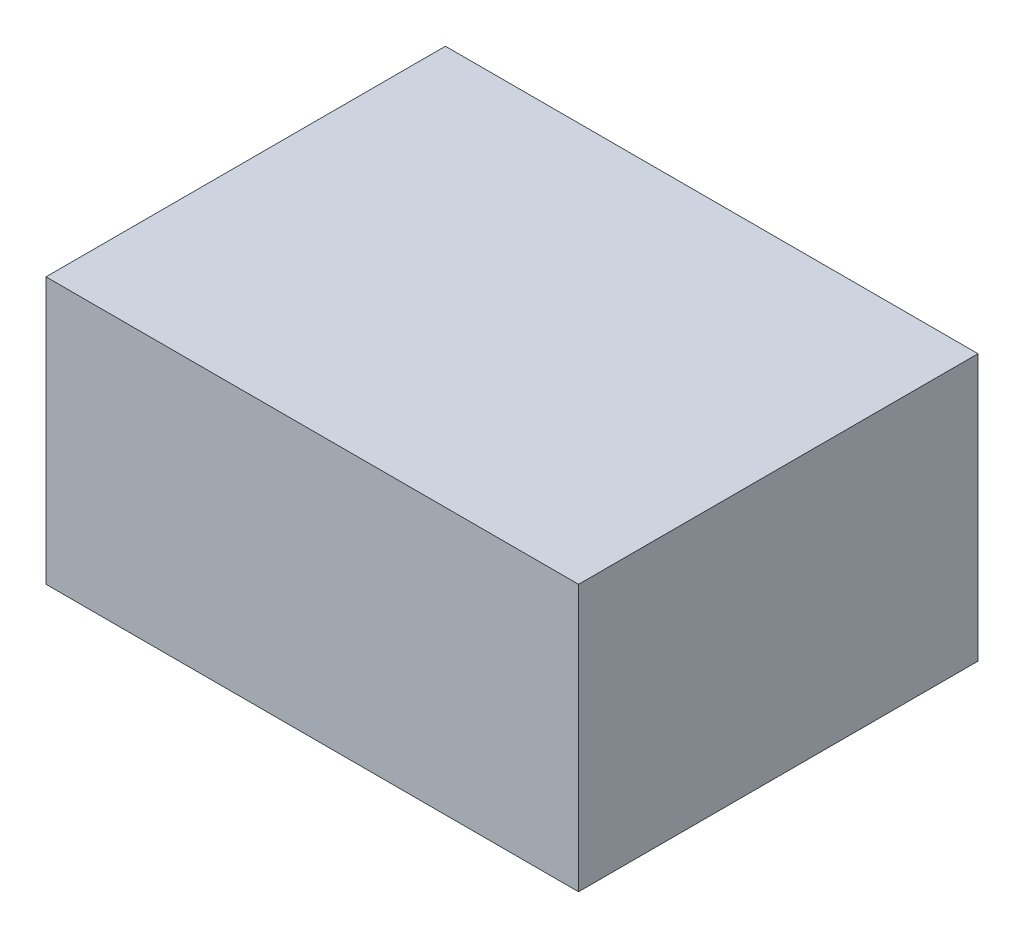
ISO-10303-21;
HEADER;
FILE_DESCRIPTION(('STEP AP214'),'2;1');
FILE_NAME('part.step','',(''),(''),'','','');
FILE_SCHEMA(('AUTOMOTIVE_DESIGN { 1 0 10303 214 1 1 1 1 }'));
ENDSEC;
DATA;
#1=APPLICATION_CONTEXT('core data for automotive mechanical design processes');
#2=APPLICATION_PROTOCOL_DEFINITION('international standard','automotive_design',2000,#1);
#3=PRODUCT_CONTEXT('',#1,'mechanical');
#4=PRODUCT('Part','Part','',(#3));
#5=PRODUCT_RELATED_PRODUCT_CATEGORY('part','',(#4));
#6=PRODUCT_DEFINITION_FORMATION('','',#4);
#7=PRODUCT_DEFINITION_CONTEXT('part definition',#1,'design');
#8=PRODUCT_DEFINITION('design','',#6,#7);
#9=PRODUCT_DEFINITION_SHAPE('','',#8);
#10=(LENGTH_UNIT() NAMED_UNIT(*) SI_UNIT(.MILLI.,.METRE.));
#11=(NAMED_UNIT(*) PLANE_ANGLE_UNIT() SI_UNIT($,.RADIAN.));
#12=(NAMED_UNIT(*) SI_UNIT($,.STERADIAN.) SOLID_ANGLE_UNIT());
#13=UNCERTAINTY_MEASURE_WITH_UNIT(LENGTH_MEASURE(1.E-05),#10,'distance_accuracy_value','');
#14=(GEOMETRIC_REPRESENTATION_CONTEXT(3) GLOBAL_UNCERTAINTY_ASSIGNED_CONTEXT((#13)) GLOBAL_UNIT_ASSIGNED_CONTEXT((#10,
#11,#12)) REPRESENTATION_CONTEXT('',''));
#15=CARTESIAN_POINT('',(0.,0.,0.));
#16=DIRECTION('',(0.,0.,1.));
#17=DIRECTION('',(1.,0.,0.));
#18=AXIS2_PLACEMENT_3D('',#15,#16,#17);
#19=CARTESIAN_POINT('',(2.,-1.,0.));
#20=DIRECTION('',(0.,-1.,0.));
#21=DIRECTION('',(0.,0.,-1.));
#22=AXIS2_PLACEMENT_3D('',#19,#20,#21);
#23=PLANE('',#22);
#24=DIRECTION('',(0.,0.,1.));
#25=VECTOR('',#24,1.);
#26=CARTESIAN_POINT('',(-2.,-1.,0.));
#27=LINE('',#26,#25);
#28=CARTESIAN_POINT('',(-2.,-1.,0.));
#29=VERTEX_POINT('',#28);
#30=CARTESIAN_POINT('',(-2.,-1.,3.));
#31=VERTEX_POINT('',#30);
#32=EDGE_CURVE('E20',#29,#31,#27,.T.);
#33=ORIENTED_EDGE('',*,*,#32,.F.);
#34=DIRECTION('',(1.,0.,0.));
#35=VECTOR('',#34,1.);
#36=CARTESIAN_POINT('',(-2.,-1.,0.));
#37=LINE('',#36,#35);
#38=CARTESIAN_POINT('',(2.,-1.,0.));
#39=VERTEX_POINT('',#38);
#40=EDGE_CURVE('E80',#29,#39,#37,.T.);
#41=ORIENTED_EDGE('',*,*,#40,.T.);
#42=DIRECTION('',(0.,0.,-1.));
#43=VECTOR('',#42,1.);
#44=CARTESIAN_POINT('',(2.,-1.,0.));
#45=LINE('',#44,#43);
#46=CARTESIAN_POINT('',(2.,-1.,3.));
#47=VERTEX_POINT('',#46);
#48=EDGE_CURVE('E68',#47,#39,#45,.T.);
#49=ORIENTED_EDGE('',*,*,#48,.F.);
#50=DIRECTION('',(1.,0.,0.));
#51=VECTOR('',#50,1.);
#52=CARTESIAN_POINT('',(-2.,-1.,3.));
#53=LINE('',#52,#51);
#54=EDGE_CURVE('E56',#31,#47,#53,.T.);
#55=ORIENTED_EDGE('',*,*,#54,.F.);
#56=EDGE_LOOP('',(#33,#41,#49,#55));
#57=FACE_BOUND('',#56,.T.);
#58=ADVANCED_FACE('F17',(#57),#23,.T.);
#59=CARTESIAN_POINT('',(-2.,-1.,0.));
#60=DIRECTION('',(-1.,0.,0.));
#61=DIRECTION('',(0.,0.,1.));
#62=AXIS2_PLACEMENT_3D('',#59,#60,#61);
#63=PLANE('',#62);
#64=DIRECTION('',(0.,0.,1.));
#65=VECTOR('',#64,1.);
#66=CARTESIAN_POINT('',(-2.,1.,0.));
#67=LINE('',#66,#65);
#68=CARTESIAN_POINT('',(-2.,1.,0.));
#69=VERTEX_POINT('',#68);
#70=CARTESIAN_POINT('',(-2.,1.,3.));
#71=VERTEX_POINT('',#70);
#72=EDGE_CURVE('E83',#69,#71,#67,.T.);
#73=ORIENTED_EDGE('',*,*,#72,.F.);
#74=DIRECTION('',(0.,1.,0.));
#75=VECTOR('',#74,1.);
#76=CARTESIAN_POINT('',(-2.,1.,0.));
#77=LINE('',#76,#75);
#78=EDGE_CURVE('E65',#69,#29,#77,.F.);
#79=ORIENTED_EDGE('',*,*,#78,.T.);
#80=ORIENTED_EDGE('',*,*,#32,.T.);
#81=DIRECTION('',(0.,1.,0.));
#82=VECTOR('',#81,1.);
#83=CARTESIAN_POINT('',(-2.,1.,3.));
#84=LINE('',#83,#82);
#85=EDGE_CURVE('E62',#71,#31,#84,.F.);
#86=ORIENTED_EDGE('',*,*,#85,.F.);
#87=EDGE_LOOP('',(#73,#79,#80,#86));
#88=FACE_BOUND('',#87,.T.);
#89=ADVANCED_FACE('F61',(#88),#63,.T.);
#90=CARTESIAN_POINT('',(-2.,1.,3.));
#91=DIRECTION('',(0.,0.,1.));
#92=DIRECTION('',(1.,0.,0.));
#93=AXIS2_PLACEMENT_3D('',#90,#91,#92);
#94=PLANE('',#93);
#95=DIRECTION('',(0.,1.,0.));
#96=VECTOR('',#95,1.);
#97=CARTESIAN_POINT('',(2.,1.,3.));
#98=LINE('',#97,#96);
#99=CARTESIAN_POINT('',(2.,1.,3.));
#100=VERTEX_POINT('',#99);
#101=EDGE_CURVE('E70',#100,#47,#98,.F.);
#102=ORIENTED_EDGE('',*,*,#101,.F.);
#103=DIRECTION('',(1.,0.,0.));
#104=VECTOR('',#103,1.);
#105=CARTESIAN_POINT('',(-2.,1.,3.));
#106=LINE('',#105,#104);
#107=EDGE_CURVE('E74',#71,#100,#106,.T.);
#108=ORIENTED_EDGE('',*,*,#107,.F.);
#109=ORIENTED_EDGE('',*,*,#85,.T.);
#110=ORIENTED_EDGE('',*,*,#54,.T.);
#111=EDGE_LOOP('',(#102,#108,#109,#110));
#112=FACE_BOUND('',#111,.T.);
#113=ADVANCED_FACE('F72',(#112),#94,.T.);
#114=CARTESIAN_POINT('',(2.,1.,0.));
#115=DIRECTION('',(1.,0.,0.));
#116=DIRECTION('',(0.,0.,-1.));
#117=AXIS2_PLACEMENT_3D('',#114,#115,#116);
#118=PLANE('',#117);
#119=ORIENTED_EDGE('',*,*,#48,.T.);
#120=DIRECTION('',(0.,1.,0.));
#121=VECTOR('',#120,1.);
#122=CARTESIAN_POINT('',(2.,1.,0.));
#123=LINE('',#122,#121);
#124=CARTESIAN_POINT('',(2.,1.,0.));
#125=VERTEX_POINT('',#124);
#126=EDGE_CURVE('E35',#39,#125,#123,.T.);
#127=ORIENTED_EDGE('',*,*,#126,.T.);
#128=DIRECTION('',(0.,0.,1.));
#129=VECTOR('',#128,1.);
#130=CARTESIAN_POINT('',(2.,1.,0.));
#131=LINE('',#130,#129);
#132=EDGE_CURVE('E26',#100,#125,#131,.F.);
#133=ORIENTED_EDGE('',*,*,#132,.F.);
#134=ORIENTED_EDGE('',*,*,#101,.T.);
#135=EDGE_LOOP('',(#119,#127,#133,#134));
#136=FACE_BOUND('',#135,.T.);
#137=ADVANCED_FACE('F89',(#136),#118,.T.);
#138=CARTESIAN_POINT('',(-2.,1.,0.));
#139=DIRECTION('',(0.,0.,1.));
#140=DIRECTION('',(1.,0.,0.));
#141=AXIS2_PLACEMENT_3D('',#138,#139,#140);
#142=PLANE('',#141);
#143=ORIENTED_EDGE('',*,*,#126,.F.);
#144=ORIENTED_EDGE('',*,*,#40,.F.);
#145=ORIENTED_EDGE('',*,*,#78,.F.);
#146=DIRECTION('',(1.,0.,0.));
#147=VECTOR('',#146,1.);
#148=CARTESIAN_POINT('',(-2.,1.,0.));
#149=LINE('',#148,#147);
#150=EDGE_CURVE('E11',#125,#69,#149,.F.);
#151=ORIENTED_EDGE('',*,*,#150,.F.);
#152=EDGE_LOOP('',(#143,#144,#145,#151));
#153=FACE_BOUND('',#152,.T.);
#154=ADVANCED_FACE('F91',(#153),#142,.F.);
#155=CARTESIAN_POINT('',(-2.,1.,0.));
#156=DIRECTION('',(0.,1.,0.));
#157=DIRECTION('',(0.,0.,1.));
#158=AXIS2_PLACEMENT_3D('',#155,#156,#157);
#159=PLANE('',#158);
#160=ORIENTED_EDGE('',*,*,#132,.T.);
#161=ORIENTED_EDGE('',*,*,#150,.T.);
#162=ORIENTED_EDGE('',*,*,#72,.T.);
#163=ORIENTED_EDGE('',*,*,#107,.T.);
#164=EDGE_LOOP('',(#160,#161,#162,#163));
#165=FACE_BOUND('',#164,.T.);
#166=ADVANCED_FACE('F88',(#165),#159,.T.);
#167=CLOSED_SHELL('',(#58,#89,#113,#137,#154,#166));
#168=MANIFOLD_SOLID_BREP('B1',#167);
#169=ADVANCED_BREP_SHAPE_REPRESENTATION('',(#18,#168),#14);
#170=SHAPE_DEFINITION_REPRESENTATION(#9,#169);
ENDSEC;
END-ISO-10303-21;
